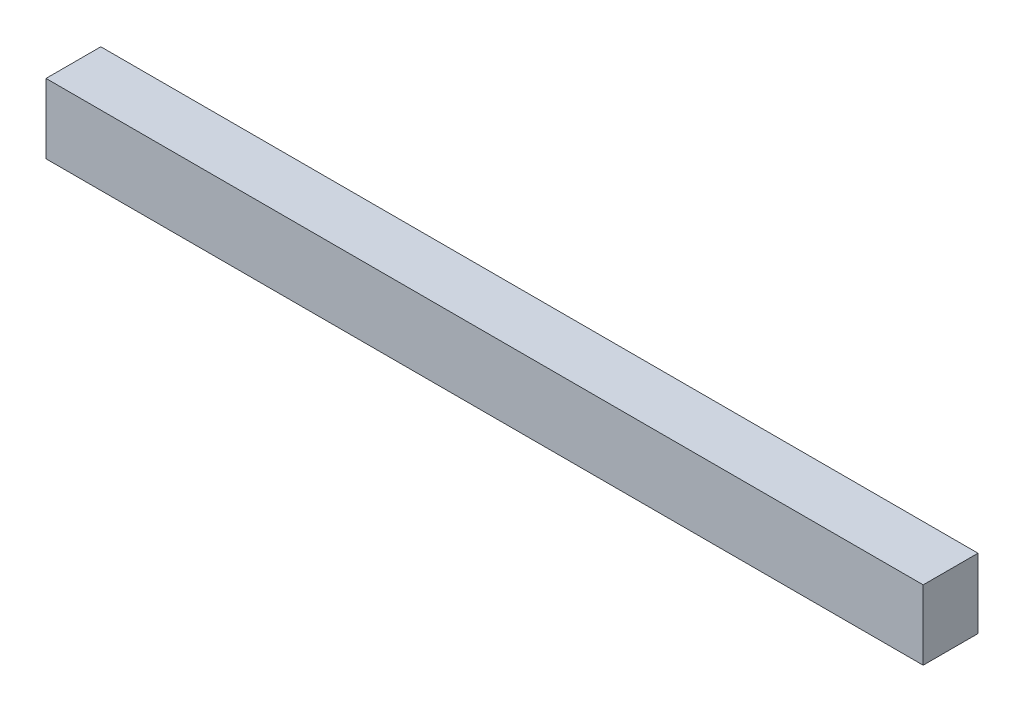
ISO-10303-21;
HEADER;
FILE_DESCRIPTION(('STEP AP214'),'2;1');
FILE_NAME('part.step','',(''),(''),'','','');
FILE_SCHEMA(('AUTOMOTIVE_DESIGN { 1 0 10303 214 1 1 1 1 }'));
ENDSEC;
DATA;
#1=APPLICATION_CONTEXT('core data for automotive mechanical design processes');
#2=APPLICATION_PROTOCOL_DEFINITION('international standard','automotive_design',2000,#1);
#3=PRODUCT_CONTEXT('',#1,'mechanical');
#4=PRODUCT('Part','Part','',(#3));
#5=PRODUCT_RELATED_PRODUCT_CATEGORY('part','',(#4));
#6=PRODUCT_DEFINITION_FORMATION('','',#4);
#7=PRODUCT_DEFINITION_CONTEXT('part definition',#1,'design');
#8=PRODUCT_DEFINITION('design','',#6,#7);
#9=PRODUCT_DEFINITION_SHAPE('','',#8);
#10=(LENGTH_UNIT() NAMED_UNIT(*) SI_UNIT(.MILLI.,.METRE.));
#11=(NAMED_UNIT(*) PLANE_ANGLE_UNIT() SI_UNIT($,.RADIAN.));
#12=(NAMED_UNIT(*) SI_UNIT($,.STERADIAN.) SOLID_ANGLE_UNIT());
#13=UNCERTAINTY_MEASURE_WITH_UNIT(LENGTH_MEASURE(1.E-05),#10,'distance_accuracy_value','');
#14=(GEOMETRIC_REPRESENTATION_CONTEXT(3) GLOBAL_UNCERTAINTY_ASSIGNED_CONTEXT((#13)) GLOBAL_UNIT_ASSIGNED_CONTEXT((#10,
#11,#12)) REPRESENTATION_CONTEXT('',''));
#15=CARTESIAN_POINT('',(0.,0.,0.));
#16=DIRECTION('',(0.,0.,1.));
#17=DIRECTION('',(1.,0.,0.));
#18=AXIS2_PLACEMENT_3D('',#15,#16,#17);
#19=CARTESIAN_POINT('',(-40.,6.35,-2.49999999999999));
#20=DIRECTION('',(1.,0.,0.));
#21=DIRECTION('',(0.,0.,-1.));
#22=AXIS2_PLACEMENT_3D('',#19,#20,#21);
#23=PLANE('',#22);
#24=DIRECTION('',(0.,0.,1.));
#25=VECTOR('',#24,1.);
#26=CARTESIAN_POINT('',(-40.,0.,-2.49999999999999));
#27=LINE('',#26,#25);
#28=CARTESIAN_POINT('',(-40.,0.,-2.49999999999999));
#29=VERTEX_POINT('',#28);
#30=CARTESIAN_POINT('',(-40.,0.,2.50000000000001));
#31=VERTEX_POINT('',#30);
#32=EDGE_CURVE('E107',#29,#31,#27,.T.);
#33=ORIENTED_EDGE('',*,*,#32,.T.);
#34=DIRECTION('',(0.,-1.,0.));
#35=VECTOR('',#34,1.);
#36=CARTESIAN_POINT('',(-40.,6.35,2.50000000000001));
#37=LINE('',#36,#35);
#38=CARTESIAN_POINT('',(-40.,6.35,2.50000000000001));
#39=VERTEX_POINT('',#38);
#40=EDGE_CURVE('E11',#39,#31,#37,.T.);
#41=ORIENTED_EDGE('',*,*,#40,.F.);
#42=DIRECTION('',(0.,0.,1.));
#43=VECTOR('',#42,1.);
#44=CARTESIAN_POINT('',(-40.,6.35,-2.49999999999999));
#45=LINE('',#44,#43);
#46=CARTESIAN_POINT('',(-40.,6.35,-2.49999999999999));
#47=VERTEX_POINT('',#46);
#48=EDGE_CURVE('E91',#47,#39,#45,.T.);
#49=ORIENTED_EDGE('',*,*,#48,.F.);
#50=DIRECTION('',(0.,-1.,0.));
#51=VECTOR('',#50,1.);
#52=CARTESIAN_POINT('',(-40.,6.35,-2.49999999999999));
#53=LINE('',#52,#51);
#54=EDGE_CURVE('E103',#47,#29,#53,.T.);
#55=ORIENTED_EDGE('',*,*,#54,.T.);
#56=EDGE_LOOP('',(#33,#41,#49,#55));
#57=FACE_BOUND('',#56,.T.);
#58=ADVANCED_FACE('F39',(#57),#23,.F.);
#59=CARTESIAN_POINT('',(40.,6.35,2.5));
#60=DIRECTION('',(0.,0.,-1.));
#61=DIRECTION('',(-1.,0.,0.));
#62=AXIS2_PLACEMENT_3D('',#59,#60,#61);
#63=PLANE('',#62);
#64=DIRECTION('',(1.,0.,0.));
#65=VECTOR('',#64,1.);
#66=CARTESIAN_POINT('',(40.,0.,2.5));
#67=LINE('',#66,#65);
#68=CARTESIAN_POINT('',(40.,0.,2.5));
#69=VERTEX_POINT('',#68);
#70=EDGE_CURVE('E96',#31,#69,#67,.T.);
#71=ORIENTED_EDGE('',*,*,#70,.T.);
#72=DIRECTION('',(0.,-1.,0.));
#73=VECTOR('',#72,1.);
#74=CARTESIAN_POINT('',(40.,6.35,2.5));
#75=LINE('',#74,#73);
#76=CARTESIAN_POINT('',(40.,6.35,2.5));
#77=VERTEX_POINT('',#76);
#78=EDGE_CURVE('E48',#77,#69,#75,.T.);
#79=ORIENTED_EDGE('',*,*,#78,.F.);
#80=DIRECTION('',(1.,0.,0.));
#81=VECTOR('',#80,1.);
#82=CARTESIAN_POINT('',(40.,6.35,2.5));
#83=LINE('',#82,#81);
#84=EDGE_CURVE('E86',#39,#77,#83,.T.);
#85=ORIENTED_EDGE('',*,*,#84,.F.);
#86=ORIENTED_EDGE('',*,*,#40,.T.);
#87=EDGE_LOOP('',(#71,#79,#85,#86));
#88=FACE_BOUND('',#87,.T.);
#89=ADVANCED_FACE('F95',(#88),#63,.F.);
#90=CARTESIAN_POINT('',(40.,6.35,-2.5));
#91=DIRECTION('',(-1.,0.,0.));
#92=DIRECTION('',(0.,0.,1.));
#93=AXIS2_PLACEMENT_3D('',#90,#91,#92);
#94=PLANE('',#93);
#95=DIRECTION('',(0.,0.,-1.));
#96=VECTOR('',#95,1.);
#97=CARTESIAN_POINT('',(40.,0.,-2.5));
#98=LINE('',#97,#96);
#99=CARTESIAN_POINT('',(40.,0.,-2.5));
#100=VERTEX_POINT('',#99);
#101=EDGE_CURVE('E73',#69,#100,#98,.T.);
#102=ORIENTED_EDGE('',*,*,#101,.T.);
#103=DIRECTION('',(0.,-1.,0.));
#104=VECTOR('',#103,1.);
#105=CARTESIAN_POINT('',(40.,6.35,-2.5));
#106=LINE('',#105,#104);
#107=CARTESIAN_POINT('',(40.,6.35,-2.5));
#108=VERTEX_POINT('',#107);
#109=EDGE_CURVE('E98',#108,#100,#106,.T.);
#110=ORIENTED_EDGE('',*,*,#109,.F.);
#111=DIRECTION('',(0.,0.,-1.));
#112=VECTOR('',#111,1.);
#113=CARTESIAN_POINT('',(40.,6.35,-2.5));
#114=LINE('',#113,#112);
#115=EDGE_CURVE('E89',#77,#108,#114,.T.);
#116=ORIENTED_EDGE('',*,*,#115,.F.);
#117=ORIENTED_EDGE('',*,*,#78,.T.);
#118=EDGE_LOOP('',(#102,#110,#116,#117));
#119=FACE_BOUND('',#118,.T.);
#120=ADVANCED_FACE('F99',(#119),#94,.F.);
#121=CARTESIAN_POINT('',(40.,6.35,-2.5));
#122=DIRECTION('',(0.,0.,1.));
#123=DIRECTION('',(1.,0.,0.));
#124=AXIS2_PLACEMENT_3D('',#121,#122,#123);
#125=PLANE('',#124);
#126=DIRECTION('',(-1.,0.,0.));
#127=VECTOR('',#126,1.);
#128=CARTESIAN_POINT('',(40.,0.,-2.5));
#129=LINE('',#128,#127);
#130=EDGE_CURVE('E79',#100,#29,#129,.T.);
#131=ORIENTED_EDGE('',*,*,#130,.T.);
#132=ORIENTED_EDGE('',*,*,#54,.F.);
#133=DIRECTION('',(-1.,0.,0.));
#134=VECTOR('',#133,1.);
#135=CARTESIAN_POINT('',(40.,6.35,-2.5));
#136=LINE('',#135,#134);
#137=EDGE_CURVE('E56',#108,#47,#136,.T.);
#138=ORIENTED_EDGE('',*,*,#137,.F.);
#139=ORIENTED_EDGE('',*,*,#109,.T.);
#140=EDGE_LOOP('',(#131,#132,#138,#139));
#141=FACE_BOUND('',#140,.T.);
#142=ADVANCED_FACE('F120',(#141),#125,.F.);
#143=CARTESIAN_POINT('',(0.,6.35,0.));
#144=DIRECTION('',(0.,-1.,0.));
#145=DIRECTION('',(0.,0.,-1.));
#146=AXIS2_PLACEMENT_3D('',#143,#144,#145);
#147=PLANE('',#146);
#148=ORIENTED_EDGE('',*,*,#48,.T.);
#149=ORIENTED_EDGE('',*,*,#84,.T.);
#150=ORIENTED_EDGE('',*,*,#115,.T.);
#151=ORIENTED_EDGE('',*,*,#137,.T.);
#152=EDGE_LOOP('',(#148,#149,#150,#151));
#153=FACE_BOUND('',#152,.T.);
#154=ADVANCED_FACE('F87',(#153),#147,.F.);
#155=CARTESIAN_POINT('',(0.,0.,0.));
#156=DIRECTION('',(0.,-1.,0.));
#157=DIRECTION('',(0.,0.,-1.));
#158=AXIS2_PLACEMENT_3D('',#155,#156,#157);
#159=PLANE('',#158);
#160=ORIENTED_EDGE('',*,*,#32,.F.);
#161=ORIENTED_EDGE('',*,*,#130,.F.);
#162=ORIENTED_EDGE('',*,*,#101,.F.);
#163=ORIENTED_EDGE('',*,*,#70,.F.);
#164=EDGE_LOOP('',(#160,#161,#162,#163));
#165=FACE_BOUND('',#164,.T.);
#166=ADVANCED_FACE('F123',(#165),#159,.T.);
#167=CLOSED_SHELL('',(#58,#89,#120,#142,#154,#166));
#168=MANIFOLD_SOLID_BREP('B2',#167);
#169=ADVANCED_BREP_SHAPE_REPRESENTATION('',(#18,#168),#14);
#170=SHAPE_DEFINITION_REPRESENTATION(#9,#169);
ENDSEC;
END-ISO-10303-21;
